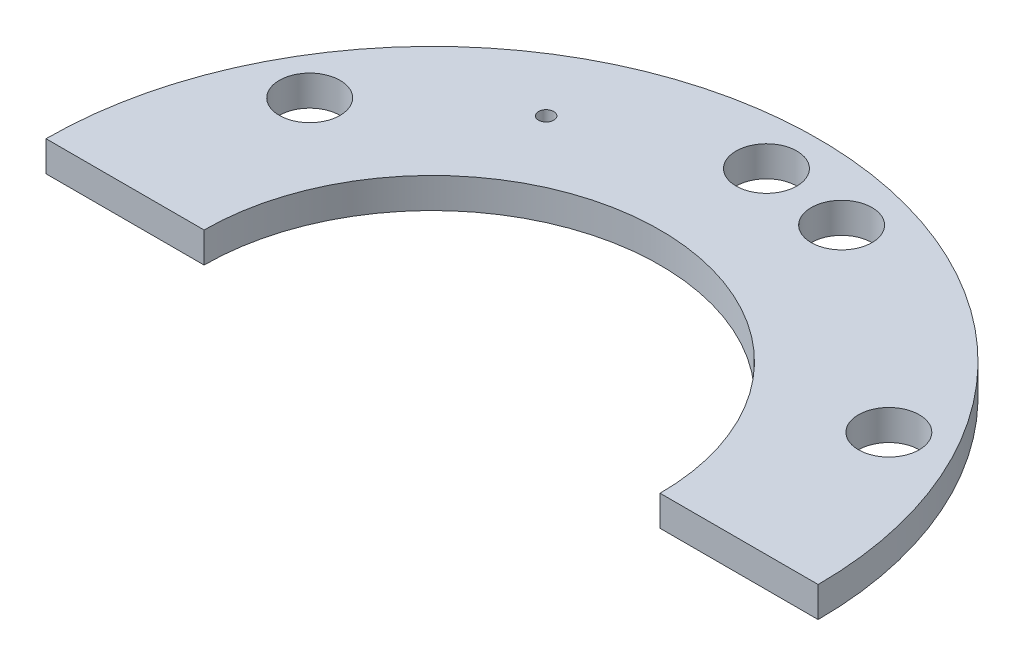
ISO-10303-21;
HEADER;
FILE_DESCRIPTION(('STEP AP214'),'2;1');
FILE_NAME('part.step','',(''),(''),'','','');
FILE_SCHEMA(('AUTOMOTIVE_DESIGN { 1 0 10303 214 1 1 1 1 }'));
ENDSEC;
DATA;
#1=APPLICATION_CONTEXT('core data for automotive mechanical design processes');
#2=APPLICATION_PROTOCOL_DEFINITION('international standard','automotive_design',2000,#1);
#3=PRODUCT_CONTEXT('',#1,'mechanical');
#4=PRODUCT('Part','Part','',(#3));
#5=PRODUCT_RELATED_PRODUCT_CATEGORY('part','',(#4));
#6=PRODUCT_DEFINITION_FORMATION('','',#4);
#7=PRODUCT_DEFINITION_CONTEXT('part definition',#1,'design');
#8=PRODUCT_DEFINITION('design','',#6,#7);
#9=PRODUCT_DEFINITION_SHAPE('','',#8);
#10=(LENGTH_UNIT() NAMED_UNIT(*) SI_UNIT(.MILLI.,.METRE.));
#11=(NAMED_UNIT(*) PLANE_ANGLE_UNIT() SI_UNIT($,.RADIAN.));
#12=(NAMED_UNIT(*) SI_UNIT($,.STERADIAN.) SOLID_ANGLE_UNIT());
#13=UNCERTAINTY_MEASURE_WITH_UNIT(LENGTH_MEASURE(1.E-05),#10,'distance_accuracy_value','');
#14=(GEOMETRIC_REPRESENTATION_CONTEXT(3) GLOBAL_UNCERTAINTY_ASSIGNED_CONTEXT((#13)) GLOBAL_UNIT_ASSIGNED_CONTEXT((#10,
#11,#12)) REPRESENTATION_CONTEXT('',''));
#15=CARTESIAN_POINT('',(0.,0.,0.));
#16=DIRECTION('',(0.,0.,1.));
#17=DIRECTION('',(1.,0.,0.));
#18=AXIS2_PLACEMENT_3D('',#15,#16,#17);
#19=CARTESIAN_POINT('',(0.,1.,0.));
#20=DIRECTION('',(0.,-1.,0.));
#21=DIRECTION('',(0.,0.,-1.));
#22=AXIS2_PLACEMENT_3D('',#19,#20,#21);
#23=CYLINDRICAL_SURFACE('',#22,12.7);
#24=DIRECTION('',(0.,-1.,0.));
#25=VECTOR('',#24,1.);
#26=CARTESIAN_POINT('',(-12.7,1.,0.));
#27=LINE('',#26,#25);
#28=CARTESIAN_POINT('',(-12.7,1.,0.));
#29=VERTEX_POINT('',#28);
#30=CARTESIAN_POINT('',(-12.7,0.,0.));
#31=VERTEX_POINT('',#30);
#32=EDGE_CURVE('E85',#29,#31,#27,.T.);
#33=ORIENTED_EDGE('',*,*,#32,.F.);
#34=CARTESIAN_POINT('',(0.,1.,0.));
#35=DIRECTION('',(0.,1.,0.));
#36=DIRECTION('',(0.,0.,1.));
#37=AXIS2_PLACEMENT_3D('',#34,#35,#36);
#38=CIRCLE('',#37,12.7);
#39=CARTESIAN_POINT('',(12.7,1.,0.));
#40=VERTEX_POINT('',#39);
#41=EDGE_CURVE('E78',#40,#29,#38,.T.);
#42=ORIENTED_EDGE('',*,*,#41,.F.);
#43=DIRECTION('',(0.,-1.,0.));
#44=VECTOR('',#43,1.);
#45=CARTESIAN_POINT('',(12.7,1.,0.));
#46=LINE('',#45,#44);
#47=CARTESIAN_POINT('',(12.7,0.,0.));
#48=VERTEX_POINT('',#47);
#49=EDGE_CURVE('E94',#48,#40,#46,.F.);
#50=ORIENTED_EDGE('',*,*,#49,.F.);
#51=CARTESIAN_POINT('',(0.,0.,0.));
#52=DIRECTION('',(0.,1.,0.));
#53=DIRECTION('',(0.,0.,1.));
#54=AXIS2_PLACEMENT_3D('',#51,#52,#53);
#55=CIRCLE('',#54,12.7);
#56=EDGE_CURVE('E112',#48,#31,#55,.T.);
#57=ORIENTED_EDGE('',*,*,#56,.T.);
#58=EDGE_LOOP('',(#33,#42,#50,#57));
#59=FACE_BOUND('',#58,.T.);
#60=ADVANCED_FACE('F34',(#59),#23,.T.);
#61=CARTESIAN_POINT('',(0.,1.,0.));
#62=DIRECTION('',(0.,1.,0.));
#63=DIRECTION('',(0.,0.,1.));
#64=AXIS2_PLACEMENT_3D('',#61,#62,#63);
#65=PLANE('',#64);
#66=CARTESIAN_POINT('',(2.84700949612775,1.,-10.6251840891797));
#67=DIRECTION('',(0.,1.,0.));
#68=DIRECTION('',(0.,0.,1.));
#69=AXIS2_PLACEMENT_3D('',#66,#67,#68);
#70=CIRCLE('',#69,1.);
#71=CARTESIAN_POINT('',(2.84700949612775,1.,-9.62518408917975));
#72=VERTEX_POINT('',#71);
#73=EDGE_CURVE('E219',#72,#72,#70,.T.);
#74=ORIENTED_EDGE('',*,*,#73,.F.);
#75=EDGE_LOOP('',(#74));
#76=FACE_BOUND('',#75,.T.);
#77=CARTESIAN_POINT('',(-5.125,1.,-8.8767603887905));
#78=DIRECTION('',(0.,1.,0.));
#79=DIRECTION('',(0.,0.,1.));
#80=AXIS2_PLACEMENT_3D('',#77,#78,#79);
#81=CIRCLE('',#80,0.25);
#82=CARTESIAN_POINT('',(-5.125,1.,-8.6267603887905));
#83=VERTEX_POINT('',#82);
#84=EDGE_CURVE('E122',#83,#83,#81,.T.);
#85=ORIENTED_EDGE('',*,*,#84,.F.);
#86=EDGE_LOOP('',(#85));
#87=FACE_BOUND('',#86,.T.);
#88=CARTESIAN_POINT('',(-9.5262794416286,1.,-5.49999999999959));
#89=DIRECTION('',(0.,1.,0.));
#90=DIRECTION('',(0.,0.,1.));
#91=AXIS2_PLACEMENT_3D('',#88,#89,#90);
#92=CIRCLE('',#91,1.00000000000047);
#93=CARTESIAN_POINT('',(-9.5262794416286,1.,-4.49999999999912));
#94=VERTEX_POINT('',#93);
#95=EDGE_CURVE('E101',#94,#94,#92,.T.);
#96=ORIENTED_EDGE('',*,*,#95,.F.);
#97=EDGE_LOOP('',(#96));
#98=FACE_BOUND('',#97,.T.);
#99=CARTESIAN_POINT('',(9.52627944162914,1.,-5.50000000000035));
#100=DIRECTION('',(0.,1.,0.));
#101=DIRECTION('',(0.,0.,1.));
#102=AXIS2_PLACEMENT_3D('',#99,#100,#101);
#103=CIRCLE('',#102,1.00000000000019);
#104=CARTESIAN_POINT('',(9.52627944162914,1.,-4.50000000000015));
#105=VERTEX_POINT('',#104);
#106=EDGE_CURVE('E106',#105,#105,#103,.T.);
#107=ORIENTED_EDGE('',*,*,#106,.F.);
#108=EDGE_LOOP('',(#107));
#109=FACE_BOUND('',#108,.T.);
#110=CARTESIAN_POINT('',(0.,1.,-11.));
#111=DIRECTION('',(0.,1.,0.));
#112=DIRECTION('',(0.,0.,1.));
#113=AXIS2_PLACEMENT_3D('',#110,#111,#112);
#114=CIRCLE('',#113,1.);
#115=CARTESIAN_POINT('',(0.,1.,-10.));
#116=VERTEX_POINT('',#115);
#117=EDGE_CURVE('E109',#116,#116,#114,.T.);
#118=ORIENTED_EDGE('',*,*,#117,.F.);
#119=EDGE_LOOP('',(#118));
#120=FACE_BOUND('',#119,.T.);
#121=ORIENTED_EDGE('',*,*,#41,.T.);
#122=DIRECTION('',(1.,0.,0.));
#123=VECTOR('',#122,1.);
#124=CARTESIAN_POINT('',(0.,1.,0.));
#125=LINE('',#124,#123);
#126=CARTESIAN_POINT('',(-7.5,1.,0.));
#127=VERTEX_POINT('',#126);
#128=EDGE_CURVE('E72',#29,#127,#125,.T.);
#129=ORIENTED_EDGE('',*,*,#128,.T.);
#130=CARTESIAN_POINT('',(0.,1.,0.));
#131=DIRECTION('',(0.,1.,0.));
#132=DIRECTION('',(0.,0.,1.));
#133=AXIS2_PLACEMENT_3D('',#130,#131,#132);
#134=CIRCLE('',#133,7.5);
#135=CARTESIAN_POINT('',(7.5,1.,0.));
#136=VERTEX_POINT('',#135);
#137=EDGE_CURVE('E83',#136,#127,#134,.T.);
#138=ORIENTED_EDGE('',*,*,#137,.F.);
#139=EDGE_CURVE('E55',#136,#40,#125,.T.);
#140=ORIENTED_EDGE('',*,*,#139,.T.);
#141=EDGE_LOOP('',(#121,#129,#138,#140));
#142=FACE_BOUND('',#141,.T.);
#143=ADVANCED_FACE('F82',(#76,#87,#98,#109,#120,#142),#65,.T.);
#144=CARTESIAN_POINT('',(0.,0.,0.));
#145=DIRECTION('',(0.,1.,0.));
#146=DIRECTION('',(0.,0.,1.));
#147=AXIS2_PLACEMENT_3D('',#144,#145,#146);
#148=PLANE('',#147);
#149=CARTESIAN_POINT('',(2.84700949612775,0.,-10.6251840891797));
#150=DIRECTION('',(0.,1.,0.));
#151=DIRECTION('',(0.,0.,1.));
#152=AXIS2_PLACEMENT_3D('',#149,#150,#151);
#153=CIRCLE('',#152,1.);
#154=CARTESIAN_POINT('',(2.84700949612775,0.,-9.62518408917975));
#155=VERTEX_POINT('',#154);
#156=EDGE_CURVE('E222',#155,#155,#153,.T.);
#157=ORIENTED_EDGE('',*,*,#156,.T.);
#158=EDGE_LOOP('',(#157));
#159=FACE_BOUND('',#158,.T.);
#160=CARTESIAN_POINT('',(-5.125,0.,-8.8767603887905));
#161=DIRECTION('',(0.,1.,0.));
#162=DIRECTION('',(0.,0.,1.));
#163=AXIS2_PLACEMENT_3D('',#160,#161,#162);
#164=CIRCLE('',#163,0.25);
#165=CARTESIAN_POINT('',(-5.125,0.,-8.6267603887905));
#166=VERTEX_POINT('',#165);
#167=EDGE_CURVE('E125',#166,#166,#164,.T.);
#168=ORIENTED_EDGE('',*,*,#167,.T.);
#169=EDGE_LOOP('',(#168));
#170=FACE_BOUND('',#169,.T.);
#171=CARTESIAN_POINT('',(-9.5262794416286,0.,-5.49999999999959));
#172=DIRECTION('',(0.,1.,0.));
#173=DIRECTION('',(0.,0.,1.));
#174=AXIS2_PLACEMENT_3D('',#171,#172,#173);
#175=CIRCLE('',#174,1.00000000000047);
#176=CARTESIAN_POINT('',(-9.5262794416286,0.,-4.49999999999912));
#177=VERTEX_POINT('',#176);
#178=EDGE_CURVE('E92',#177,#177,#175,.T.);
#179=ORIENTED_EDGE('',*,*,#178,.T.);
#180=EDGE_LOOP('',(#179));
#181=FACE_BOUND('',#180,.T.);
#182=CARTESIAN_POINT('',(9.52627944162914,0.,-5.50000000000035));
#183=DIRECTION('',(0.,1.,0.));
#184=DIRECTION('',(0.,0.,1.));
#185=AXIS2_PLACEMENT_3D('',#182,#183,#184);
#186=CIRCLE('',#185,1.00000000000019);
#187=CARTESIAN_POINT('',(9.52627944162914,0.,-4.50000000000015));
#188=VERTEX_POINT('',#187);
#189=EDGE_CURVE('E88',#188,#188,#186,.T.);
#190=ORIENTED_EDGE('',*,*,#189,.T.);
#191=EDGE_LOOP('',(#190));
#192=FACE_BOUND('',#191,.T.);
#193=CARTESIAN_POINT('',(0.,0.,-11.));
#194=DIRECTION('',(0.,1.,0.));
#195=DIRECTION('',(0.,0.,1.));
#196=AXIS2_PLACEMENT_3D('',#193,#194,#195);
#197=CIRCLE('',#196,1.);
#198=CARTESIAN_POINT('',(0.,0.,-10.));
#199=VERTEX_POINT('',#198);
#200=EDGE_CURVE('E98',#199,#199,#197,.T.);
#201=ORIENTED_EDGE('',*,*,#200,.T.);
#202=EDGE_LOOP('',(#201));
#203=FACE_BOUND('',#202,.T.);
#204=DIRECTION('',(1.,0.,0.));
#205=VECTOR('',#204,1.);
#206=CARTESIAN_POINT('',(0.,0.,0.));
#207=LINE('',#206,#205);
#208=CARTESIAN_POINT('',(-7.5,0.,0.));
#209=VERTEX_POINT('',#208);
#210=EDGE_CURVE('E48',#31,#209,#207,.T.);
#211=ORIENTED_EDGE('',*,*,#210,.F.);
#212=ORIENTED_EDGE('',*,*,#56,.F.);
#213=CARTESIAN_POINT('',(7.5,0.,0.));
#214=VERTEX_POINT('',#213);
#215=EDGE_CURVE('E121',#214,#48,#207,.T.);
#216=ORIENTED_EDGE('',*,*,#215,.F.);
#217=CARTESIAN_POINT('',(0.,0.,0.));
#218=DIRECTION('',(0.,1.,0.));
#219=DIRECTION('',(0.,0.,1.));
#220=AXIS2_PLACEMENT_3D('',#217,#218,#219);
#221=CIRCLE('',#220,7.5);
#222=EDGE_CURVE('E89',#214,#209,#221,.T.);
#223=ORIENTED_EDGE('',*,*,#222,.T.);
#224=EDGE_LOOP('',(#211,#212,#216,#223));
#225=FACE_BOUND('',#224,.T.);
#226=ADVANCED_FACE('F120',(#159,#170,#181,#192,#203,#225),#148,.F.);
#227=CARTESIAN_POINT('',(0.,0.,0.));
#228=DIRECTION('',(0.,1.,0.));
#229=DIRECTION('',(0.,0.,1.));
#230=AXIS2_PLACEMENT_3D('',#227,#228,#229);
#231=CYLINDRICAL_SURFACE('',#230,7.5);
#232=DIRECTION('',(0.,1.,0.));
#233=VECTOR('',#232,1.);
#234=CARTESIAN_POINT('',(7.5,0.,0.));
#235=LINE('',#234,#233);
#236=EDGE_CURVE('E11',#136,#214,#235,.F.);
#237=ORIENTED_EDGE('',*,*,#236,.F.);
#238=ORIENTED_EDGE('',*,*,#137,.T.);
#239=DIRECTION('',(0.,1.,0.));
#240=VECTOR('',#239,1.);
#241=CARTESIAN_POINT('',(-7.5,0.,0.));
#242=LINE('',#241,#240);
#243=EDGE_CURVE('E41',#209,#127,#242,.T.);
#244=ORIENTED_EDGE('',*,*,#243,.F.);
#245=ORIENTED_EDGE('',*,*,#222,.F.);
#246=EDGE_LOOP('',(#237,#238,#244,#245));
#247=FACE_BOUND('',#246,.T.);
#248=ADVANCED_FACE('F87',(#247),#231,.F.);
#249=CARTESIAN_POINT('',(-9.5262794416286,0.,-5.49999999999959));
#250=DIRECTION('',(0.,1.,0.));
#251=DIRECTION('',(0.,0.,1.));
#252=AXIS2_PLACEMENT_3D('',#249,#250,#251);
#253=CYLINDRICAL_SURFACE('',#252,1.00000000000047);
#254=ORIENTED_EDGE('',*,*,#95,.T.);
#255=EDGE_LOOP('',(#254));
#256=FACE_BOUND('',#255,.T.);
#257=ORIENTED_EDGE('',*,*,#178,.F.);
#258=EDGE_LOOP('',(#257));
#259=FACE_BOUND('',#258,.T.);
#260=ADVANCED_FACE('F157',(#256,#259),#253,.F.);
#261=CARTESIAN_POINT('',(9.52627944162914,0.,-5.50000000000035));
#262=DIRECTION('',(0.,1.,0.));
#263=DIRECTION('',(0.,0.,1.));
#264=AXIS2_PLACEMENT_3D('',#261,#262,#263);
#265=CYLINDRICAL_SURFACE('',#264,1.00000000000019);
#266=ORIENTED_EDGE('',*,*,#106,.T.);
#267=EDGE_LOOP('',(#266));
#268=FACE_BOUND('',#267,.T.);
#269=ORIENTED_EDGE('',*,*,#189,.F.);
#270=EDGE_LOOP('',(#269));
#271=FACE_BOUND('',#270,.T.);
#272=ADVANCED_FACE('F154',(#268,#271),#265,.F.);
#273=CARTESIAN_POINT('',(0.,0.,-11.));
#274=DIRECTION('',(0.,1.,0.));
#275=DIRECTION('',(0.,0.,1.));
#276=AXIS2_PLACEMENT_3D('',#273,#274,#275);
#277=CYLINDRICAL_SURFACE('',#276,1.);
#278=ORIENTED_EDGE('',*,*,#117,.T.);
#279=EDGE_LOOP('',(#278));
#280=FACE_BOUND('',#279,.T.);
#281=ORIENTED_EDGE('',*,*,#200,.F.);
#282=EDGE_LOOP('',(#281));
#283=FACE_BOUND('',#282,.T.);
#284=ADVANCED_FACE('F139',(#280,#283),#277,.F.);
#285=CARTESIAN_POINT('',(0.,0.,0.));
#286=DIRECTION('',(0.,0.,1.));
#287=DIRECTION('',(1.,0.,0.));
#288=AXIS2_PLACEMENT_3D('',#285,#286,#287);
#289=PLANE('',#288);
#290=ORIENTED_EDGE('',*,*,#32,.T.);
#291=ORIENTED_EDGE('',*,*,#210,.T.);
#292=ORIENTED_EDGE('',*,*,#243,.T.);
#293=ORIENTED_EDGE('',*,*,#128,.F.);
#294=EDGE_LOOP('',(#290,#291,#292,#293));
#295=FACE_BOUND('',#294,.T.);
#296=ADVANCED_FACE('F71',(#295),#289,.T.);
#297=ORIENTED_EDGE('',*,*,#49,.T.);
#298=ORIENTED_EDGE('',*,*,#139,.F.);
#299=ORIENTED_EDGE('',*,*,#236,.T.);
#300=ORIENTED_EDGE('',*,*,#215,.T.);
#301=EDGE_LOOP('',(#297,#298,#299,#300));
#302=FACE_BOUND('',#301,.T.);
#303=ADVANCED_FACE('F128',(#302),#289,.T.);
#304=CARTESIAN_POINT('',(-5.125,0.,-8.8767603887905));
#305=DIRECTION('',(0.,1.,0.));
#306=DIRECTION('',(0.,0.,1.));
#307=AXIS2_PLACEMENT_3D('',#304,#305,#306);
#308=CYLINDRICAL_SURFACE('',#307,0.25);
#309=ORIENTED_EDGE('',*,*,#84,.T.);
#310=EDGE_LOOP('',(#309));
#311=FACE_BOUND('',#310,.T.);
#312=ORIENTED_EDGE('',*,*,#167,.F.);
#313=EDGE_LOOP('',(#312));
#314=FACE_BOUND('',#313,.T.);
#315=ADVANCED_FACE('F130',(#311,#314),#308,.F.);
#316=CARTESIAN_POINT('',(2.84700949612775,0.,-10.6251840891797));
#317=DIRECTION('',(0.,1.,0.));
#318=DIRECTION('',(0.,0.,1.));
#319=AXIS2_PLACEMENT_3D('',#316,#317,#318);
#320=CYLINDRICAL_SURFACE('',#319,1.);
#321=ORIENTED_EDGE('',*,*,#73,.T.);
#322=EDGE_LOOP('',(#321));
#323=FACE_BOUND('',#322,.T.);
#324=ORIENTED_EDGE('',*,*,#156,.F.);
#325=EDGE_LOOP('',(#324));
#326=FACE_BOUND('',#325,.T.);
#327=ADVANCED_FACE('F136',(#323,#326),#320,.F.);
#328=CLOSED_SHELL('',(#60,#143,#226,#248,#260,#272,#284,#296,#303,#315,#327));
#329=MANIFOLD_SOLID_BREP('B2',#328);
#330=ADVANCED_BREP_SHAPE_REPRESENTATION('',(#18,#329),#14);
#331=SHAPE_DEFINITION_REPRESENTATION(#9,#330);
ENDSEC;
END-ISO-10303-21;
